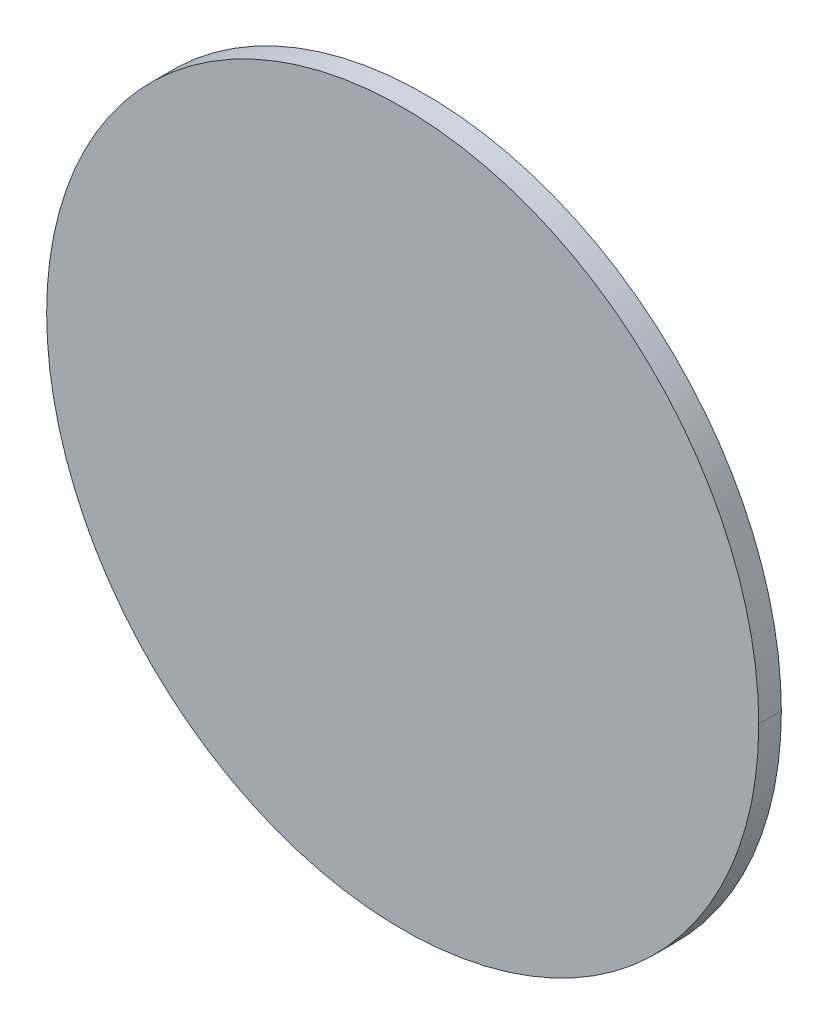
ISO-10303-21;
HEADER;
FILE_DESCRIPTION(('STEP AP214'),'2;1');
FILE_NAME('part.step','',(''),(''),'','','');
FILE_SCHEMA(('AUTOMOTIVE_DESIGN { 1 0 10303 214 1 1 1 1 }'));
ENDSEC;
DATA;
#1=APPLICATION_CONTEXT('core data for automotive mechanical design processes');
#2=APPLICATION_PROTOCOL_DEFINITION('international standard','automotive_design',2000,#1);
#3=PRODUCT_CONTEXT('',#1,'mechanical');
#4=PRODUCT('Part','Part','',(#3));
#5=PRODUCT_RELATED_PRODUCT_CATEGORY('part','',(#4));
#6=PRODUCT_DEFINITION_FORMATION('','',#4);
#7=PRODUCT_DEFINITION_CONTEXT('part definition',#1,'design');
#8=PRODUCT_DEFINITION('design','',#6,#7);
#9=PRODUCT_DEFINITION_SHAPE('','',#8);
#10=(LENGTH_UNIT() NAMED_UNIT(*) SI_UNIT(.MILLI.,.METRE.));
#11=(NAMED_UNIT(*) PLANE_ANGLE_UNIT() SI_UNIT($,.RADIAN.));
#12=(NAMED_UNIT(*) SI_UNIT($,.STERADIAN.) SOLID_ANGLE_UNIT());
#13=UNCERTAINTY_MEASURE_WITH_UNIT(LENGTH_MEASURE(1.E-05),#10,'distance_accuracy_value','');
#14=(GEOMETRIC_REPRESENTATION_CONTEXT(3) GLOBAL_UNCERTAINTY_ASSIGNED_CONTEXT((#13)) GLOBAL_UNIT_ASSIGNED_CONTEXT((#10,
#11,#12)) REPRESENTATION_CONTEXT('',''));
#15=CARTESIAN_POINT('',(0.,0.,0.));
#16=DIRECTION('',(0.,0.,1.));
#17=DIRECTION('',(1.,0.,0.));
#18=AXIS2_PLACEMENT_3D('',#15,#16,#17);
#19=CARTESIAN_POINT('',(21.437498779297,33.700000424385,0.0127));
#20=DIRECTION('',(0.,0.,1.));
#21=DIRECTION('',(1.,0.,0.));
#22=AXIS2_PLACEMENT_3D('',#19,#20,#21);
#23=PLANE('',#22);
#24=CARTESIAN_POINT('',(21.437498779297,33.700000424385,0.0127));
#25=DIRECTION('',(0.,0.,-1.));
#26=DIRECTION('',(1.,0.,0.));
#27=AXIS2_PLACEMENT_3D('',#24,#25,#26);
#28=CIRCLE('',#27,0.199999575619);
#29=CARTESIAN_POINT('',(21.637498354916,33.700000424385,0.0127));
#30=VERTEX_POINT('',#29);
#31=CARTESIAN_POINT('',(21.237499203678,33.700000424385,0.0127));
#32=VERTEX_POINT('',#31);
#33=EDGE_CURVE('E11',#30,#32,#28,.T.);
#34=ORIENTED_EDGE('',*,*,#33,.F.);
#35=CARTESIAN_POINT('',(21.437498779297,33.700000424385,0.0127));
#36=DIRECTION('',(0.,0.,-1.));
#37=DIRECTION('',(1.,0.,0.));
#38=AXIS2_PLACEMENT_3D('',#35,#36,#37);
#39=CIRCLE('',#38,0.199999575619);
#40=EDGE_CURVE('E63',#32,#30,#39,.T.);
#41=ORIENTED_EDGE('',*,*,#40,.F.);
#42=EDGE_LOOP('',(#34,#41));
#43=FACE_BOUND('',#42,.T.);
#44=ADVANCED_FACE('F17',(#43),#23,.T.);
#45=CARTESIAN_POINT('',(21.437498779297,33.700000424385,0.));
#46=DIRECTION('',(0.,0.,1.));
#47=DIRECTION('',(1.,0.,0.));
#48=AXIS2_PLACEMENT_3D('',#45,#46,#47);
#49=CYLINDRICAL_SURFACE('',#48,0.199999575619);
#50=DIRECTION('',(0.,0.,1.));
#51=VECTOR('',#50,1.);
#52=CARTESIAN_POINT('',(21.237499203678,33.700000424385,0.));
#53=LINE('',#52,#51);
#54=CARTESIAN_POINT('',(21.237499203678,33.700000424385,0.));
#55=VERTEX_POINT('',#54);
#56=EDGE_CURVE('E56',#55,#32,#53,.T.);
#57=ORIENTED_EDGE('',*,*,#56,.F.);
#58=CARTESIAN_POINT('',(21.437498779297,33.700000424385,0.));
#59=DIRECTION('',(0.,0.,1.));
#60=DIRECTION('',(1.,0.,0.));
#61=AXIS2_PLACEMENT_3D('',#58,#59,#60);
#62=CIRCLE('',#61,0.199999575619);
#63=CARTESIAN_POINT('',(21.637498354916,33.700000424385,0.));
#64=VERTEX_POINT('',#63);
#65=EDGE_CURVE('E27',#55,#64,#62,.T.);
#66=ORIENTED_EDGE('',*,*,#65,.T.);
#67=DIRECTION('',(0.,0.,1.));
#68=VECTOR('',#67,1.);
#69=CARTESIAN_POINT('',(21.637498354916,33.700000424385,0.));
#70=LINE('',#69,#68);
#71=EDGE_CURVE('E20',#64,#30,#70,.T.);
#72=ORIENTED_EDGE('',*,*,#71,.T.);
#73=ORIENTED_EDGE('',*,*,#33,.T.);
#74=EDGE_LOOP('',(#57,#66,#72,#73));
#75=FACE_BOUND('',#74,.T.);
#76=ADVANCED_FACE('F53',(#75),#49,.T.);
#77=CARTESIAN_POINT('',(21.437498779297,33.700000424385,0.));
#78=DIRECTION('',(0.,0.,1.));
#79=DIRECTION('',(1.,0.,0.));
#80=AXIS2_PLACEMENT_3D('',#77,#78,#79);
#81=PLANE('',#80);
#82=CARTESIAN_POINT('',(21.437498779297,33.700000424385,0.));
#83=DIRECTION('',(0.,0.,1.));
#84=DIRECTION('',(1.,0.,0.));
#85=AXIS2_PLACEMENT_3D('',#82,#83,#84);
#86=CIRCLE('',#85,0.199999575619);
#87=EDGE_CURVE('E62',#64,#55,#86,.T.);
#88=ORIENTED_EDGE('',*,*,#87,.F.);
#89=ORIENTED_EDGE('',*,*,#65,.F.);
#90=EDGE_LOOP('',(#88,#89));
#91=FACE_BOUND('',#90,.T.);
#92=ADVANCED_FACE('F65',(#91),#81,.F.);
#93=CARTESIAN_POINT('',(21.437498779297,33.700000424385,0.));
#94=DIRECTION('',(0.,0.,1.));
#95=DIRECTION('',(1.,0.,0.));
#96=AXIS2_PLACEMENT_3D('',#93,#94,#95);
#97=CYLINDRICAL_SURFACE('',#96,0.199999575619);
#98=ORIENTED_EDGE('',*,*,#87,.T.);
#99=ORIENTED_EDGE('',*,*,#56,.T.);
#100=ORIENTED_EDGE('',*,*,#40,.T.);
#101=ORIENTED_EDGE('',*,*,#71,.F.);
#102=EDGE_LOOP('',(#98,#99,#100,#101));
#103=FACE_BOUND('',#102,.T.);
#104=ADVANCED_FACE('F61',(#103),#97,.T.);
#105=CLOSED_SHELL('',(#44,#76,#92,#104));
#106=MANIFOLD_SOLID_BREP('B1',#105);
#107=ADVANCED_BREP_SHAPE_REPRESENTATION('',(#18,#106),#14);
#108=SHAPE_DEFINITION_REPRESENTATION(#9,#107);
ENDSEC;
END-ISO-10303-21;
